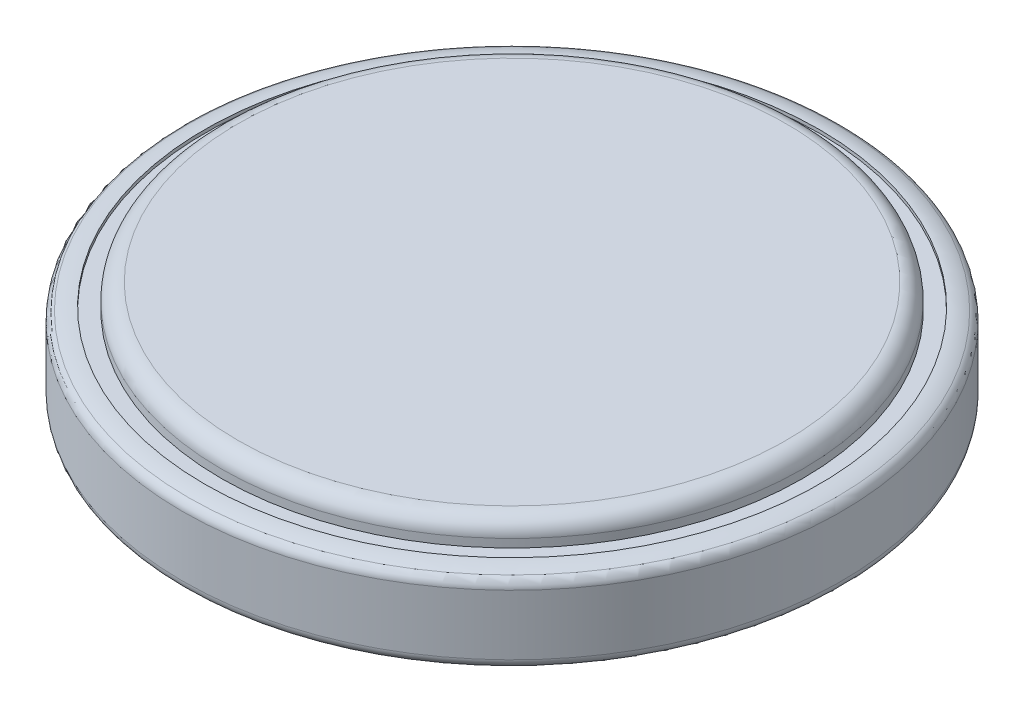
ISO-10303-21;
HEADER;
FILE_DESCRIPTION(('STEP AP214'),'2;1');
FILE_NAME('part.step','',(''),(''),'','','');
FILE_SCHEMA(('AUTOMOTIVE_DESIGN { 1 0 10303 214 1 1 1 1 }'));
ENDSEC;
DATA;
#1=APPLICATION_CONTEXT('core data for automotive mechanical design processes');
#2=APPLICATION_PROTOCOL_DEFINITION('international standard','automotive_design',2000,#1);
#3=PRODUCT_CONTEXT('',#1,'mechanical');
#4=PRODUCT('Part','Part','',(#3));
#5=PRODUCT_RELATED_PRODUCT_CATEGORY('part','',(#4));
#6=PRODUCT_DEFINITION_FORMATION('','',#4);
#7=PRODUCT_DEFINITION_CONTEXT('part definition',#1,'design');
#8=PRODUCT_DEFINITION('design','',#6,#7);
#9=PRODUCT_DEFINITION_SHAPE('','',#8);
#10=(LENGTH_UNIT() NAMED_UNIT(*) SI_UNIT(.MILLI.,.METRE.));
#11=(NAMED_UNIT(*) PLANE_ANGLE_UNIT() SI_UNIT($,.RADIAN.));
#12=(NAMED_UNIT(*) SI_UNIT($,.STERADIAN.) SOLID_ANGLE_UNIT());
#13=UNCERTAINTY_MEASURE_WITH_UNIT(LENGTH_MEASURE(1.E-05),#10,'distance_accuracy_value','');
#14=(GEOMETRIC_REPRESENTATION_CONTEXT(3) GLOBAL_UNCERTAINTY_ASSIGNED_CONTEXT((#13)) GLOBAL_UNIT_ASSIGNED_CONTEXT((#10,
#11,#12)) REPRESENTATION_CONTEXT('',''));
#15=CARTESIAN_POINT('',(0.,0.,0.));
#16=DIRECTION('',(0.,0.,1.));
#17=DIRECTION('',(1.,0.,0.));
#18=AXIS2_PLACEMENT_3D('',#15,#16,#17);
#19=CARTESIAN_POINT('',(0.,3.15,0.));
#20=DIRECTION('',(0.,-1.,0.));
#21=DIRECTION('',(0.,0.,-1.));
#22=AXIS2_PLACEMENT_3D('',#19,#20,#21);
#23=CYLINDRICAL_SURFACE('',#22,9.975);
#24=CARTESIAN_POINT('',(0.,0.3,0.));
#25=DIRECTION('',(0.,1.,0.));
#26=DIRECTION('',(0.,0.,1.));
#27=AXIS2_PLACEMENT_3D('',#24,#25,#26);
#28=CIRCLE('',#27,9.975);
#29=CARTESIAN_POINT('',(0.,0.3,9.975));
#30=VERTEX_POINT('',#29);
#31=EDGE_CURVE('E45',#30,#30,#28,.T.);
#32=ORIENTED_EDGE('',*,*,#31,.T.);
#33=EDGE_LOOP('',(#32));
#34=FACE_BOUND('',#33,.T.);
#35=CARTESIAN_POINT('',(0.,2.121875,0.));
#36=DIRECTION('',(0.,1.,0.));
#37=DIRECTION('',(0.,0.,1.));
#38=AXIS2_PLACEMENT_3D('',#35,#36,#37);
#39=CIRCLE('',#38,9.975);
#40=CARTESIAN_POINT('',(0.,2.121875,9.975));
#41=VERTEX_POINT('',#40);
#42=EDGE_CURVE('E49',#41,#41,#39,.F.);
#43=ORIENTED_EDGE('',*,*,#42,.T.);
#44=EDGE_LOOP('',(#43));
#45=FACE_BOUND('',#44,.T.);
#46=ADVANCED_FACE('F34',(#34,#45),#23,.T.);
#47=CARTESIAN_POINT('',(0.,0.,0.));
#48=DIRECTION('',(0.,1.,0.));
#49=DIRECTION('',(0.,0.,1.));
#50=AXIS2_PLACEMENT_3D('',#47,#48,#49);
#51=PLANE('',#50);
#52=CARTESIAN_POINT('',(0.,0.,0.));
#53=DIRECTION('',(0.,1.,0.));
#54=DIRECTION('',(0.,0.,1.));
#55=AXIS2_PLACEMENT_3D('',#52,#53,#54);
#56=CIRCLE('',#55,9.675);
#57=CARTESIAN_POINT('',(0.,0.,9.675));
#58=VERTEX_POINT('',#57);
#59=EDGE_CURVE('E41',#58,#58,#56,.F.);
#60=ORIENTED_EDGE('',*,*,#59,.T.);
#61=EDGE_LOOP('',(#60));
#62=FACE_BOUND('',#61,.T.);
#63=ADVANCED_FACE('F87',(#62),#51,.F.);
#64=CARTESIAN_POINT('',(0.,1.26093750000001,0.));
#65=DIRECTION('',(0.,-1.,0.));
#66=DIRECTION('',(0.,0.,-1.));
#67=AXIS2_PLACEMENT_3D('',#64,#65,#66);
#68=TOROIDAL_SURFACE('',#67,9.3,1.23906249999999);
#69=CARTESIAN_POINT('',(0.,2.39691659733769,0.));
#70=DIRECTION('',(0.,-1.,0.));
#71=DIRECTION('',(0.,0.,-1.));
#72=AXIS2_PLACEMENT_3D('',#69,#70,#71);
#73=CIRCLE('',#72,9.79480033277867);
#74=CARTESIAN_POINT('',(0.,2.39691659733769,-9.79480033277867));
#75=VERTEX_POINT('',#74);
#76=EDGE_CURVE('E10',#75,#75,#73,.F.);
#77=ORIENTED_EDGE('',*,*,#76,.T.);
#78=EDGE_LOOP('',(#77));
#79=FACE_BOUND('',#78,.T.);
#80=CARTESIAN_POINT('',(0.,2.5,0.));
#81=DIRECTION('',(0.,1.,0.));
#82=DIRECTION('',(0.,0.,1.));
#83=AXIS2_PLACEMENT_3D('',#80,#81,#82);
#84=CIRCLE('',#83,9.3);
#85=CARTESIAN_POINT('',(0.,2.5,9.3));
#86=VERTEX_POINT('',#85);
#87=EDGE_CURVE('E61',#86,#86,#84,.T.);
#88=ORIENTED_EDGE('',*,*,#87,.F.);
#89=EDGE_LOOP('',(#88));
#90=FACE_BOUND('',#89,.T.);
#91=ADVANCED_FACE('F82',(#79,#90),#68,.T.);
#92=CARTESIAN_POINT('',(0.,2.4,0.));
#93=DIRECTION('',(0.,1.,0.));
#94=DIRECTION('',(0.,0.,1.));
#95=AXIS2_PLACEMENT_3D('',#92,#93,#94);
#96=CYLINDRICAL_SURFACE('',#95,9.3);
#97=CARTESIAN_POINT('',(0.,2.4,0.));
#98=DIRECTION('',(0.,1.,0.));
#99=DIRECTION('',(0.,0.,1.));
#100=AXIS2_PLACEMENT_3D('',#97,#98,#99);
#101=CIRCLE('',#100,9.3);
#102=CARTESIAN_POINT('',(0.,2.4,9.3));
#103=VERTEX_POINT('',#102);
#104=EDGE_CURVE('E60',#103,#103,#101,.T.);
#105=ORIENTED_EDGE('',*,*,#104,.F.);
#106=EDGE_LOOP('',(#105));
#107=FACE_BOUND('',#106,.T.);
#108=ORIENTED_EDGE('',*,*,#87,.T.);
#109=EDGE_LOOP('',(#108));
#110=FACE_BOUND('',#109,.T.);
#111=ADVANCED_FACE('F76',(#107,#110),#96,.F.);
#112=CARTESIAN_POINT('',(0.,2.4,0.));
#113=DIRECTION('',(0.,1.,0.));
#114=DIRECTION('',(0.,0.,1.));
#115=AXIS2_PLACEMENT_3D('',#112,#113,#114);
#116=PLANE('',#115);
#117=CARTESIAN_POINT('',(0.,2.4,0.));
#118=DIRECTION('',(0.,1.,0.));
#119=DIRECTION('',(0.,0.,1.));
#120=AXIS2_PLACEMENT_3D('',#117,#118,#119);
#121=CIRCLE('',#120,8.8);
#122=CARTESIAN_POINT('',(0.,2.4,8.8));
#123=VERTEX_POINT('',#122);
#124=EDGE_CURVE('E64',#123,#123,#121,.T.);
#125=ORIENTED_EDGE('',*,*,#124,.F.);
#126=EDGE_LOOP('',(#125));
#127=FACE_BOUND('',#126,.T.);
#128=ORIENTED_EDGE('',*,*,#104,.T.);
#129=EDGE_LOOP('',(#128));
#130=FACE_BOUND('',#129,.T.);
#131=ADVANCED_FACE('F72',(#127,#130),#116,.T.);
#132=CARTESIAN_POINT('',(0.,3.15,0.));
#133=DIRECTION('',(0.,1.,0.));
#134=DIRECTION('',(0.,0.,1.));
#135=AXIS2_PLACEMENT_3D('',#132,#133,#134);
#136=PLANE('',#135);
#137=CARTESIAN_POINT('',(0.,3.15,0.));
#138=DIRECTION('',(0.,1.,0.));
#139=DIRECTION('',(0.,0.,1.));
#140=AXIS2_PLACEMENT_3D('',#137,#138,#139);
#141=CIRCLE('',#140,8.3);
#142=CARTESIAN_POINT('',(0.,3.15,8.3));
#143=VERTEX_POINT('',#142);
#144=EDGE_CURVE('E54',#143,#143,#141,.T.);
#145=ORIENTED_EDGE('',*,*,#144,.T.);
#146=EDGE_LOOP('',(#145));
#147=FACE_BOUND('',#146,.T.);
#148=ADVANCED_FACE('F75',(#147),#136,.T.);
#149=CARTESIAN_POINT('',(0.,2.65,0.));
#150=DIRECTION('',(0.,1.,0.));
#151=DIRECTION('',(0.,0.,1.));
#152=AXIS2_PLACEMENT_3D('',#149,#150,#151);
#153=TOROIDAL_SURFACE('',#152,8.3,0.5);
#154=ORIENTED_EDGE('',*,*,#144,.F.);
#155=EDGE_LOOP('',(#154));
#156=FACE_BOUND('',#155,.T.);
#157=CARTESIAN_POINT('',(0.,2.65,0.));
#158=DIRECTION('',(0.,1.,0.));
#159=DIRECTION('',(0.,0.,1.));
#160=AXIS2_PLACEMENT_3D('',#157,#158,#159);
#161=CIRCLE('',#160,8.8);
#162=CARTESIAN_POINT('',(0.,2.65,8.8));
#163=VERTEX_POINT('',#162);
#164=EDGE_CURVE('E57',#163,#163,#161,.F.);
#165=ORIENTED_EDGE('',*,*,#164,.F.);
#166=EDGE_LOOP('',(#165));
#167=FACE_BOUND('',#166,.T.);
#168=ADVANCED_FACE('F102',(#156,#167),#153,.T.);
#169=CARTESIAN_POINT('',(0.,0.,0.));
#170=DIRECTION('',(0.,-1.,0.));
#171=DIRECTION('',(0.,0.,-1.));
#172=AXIS2_PLACEMENT_3D('',#169,#170,#171);
#173=CYLINDRICAL_SURFACE('',#172,8.8);
#174=ORIENTED_EDGE('',*,*,#164,.T.);
#175=EDGE_LOOP('',(#174));
#176=FACE_BOUND('',#175,.T.);
#177=ORIENTED_EDGE('',*,*,#124,.T.);
#178=EDGE_LOOP('',(#177));
#179=FACE_BOUND('',#178,.T.);
#180=ADVANCED_FACE('F70',(#176,#179),#173,.T.);
#181=CARTESIAN_POINT('',(0.,0.3,0.));
#182=DIRECTION('',(0.,1.,0.));
#183=DIRECTION('',(0.,0.,1.));
#184=AXIS2_PLACEMENT_3D('',#181,#182,#183);
#185=TOROIDAL_SURFACE('',#184,9.675,0.3);
#186=ORIENTED_EDGE('',*,*,#59,.F.);
#187=EDGE_LOOP('',(#186));
#188=FACE_BOUND('',#187,.T.);
#189=ORIENTED_EDGE('',*,*,#31,.F.);
#190=EDGE_LOOP('',(#189));
#191=FACE_BOUND('',#190,.T.);
#192=ADVANCED_FACE('F105',(#188,#191),#185,.T.);
#193=CARTESIAN_POINT('',(0.,2.121875,0.));
#194=DIRECTION('',(0.,1.,0.));
#195=DIRECTION('',(0.,0.,1.));
#196=AXIS2_PLACEMENT_3D('',#193,#194,#195);
#197=TOROIDAL_SURFACE('',#196,9.675,0.3);
#198=ORIENTED_EDGE('',*,*,#76,.F.);
#199=EDGE_LOOP('',(#198));
#200=FACE_BOUND('',#199,.T.);
#201=ORIENTED_EDGE('',*,*,#42,.F.);
#202=EDGE_LOOP('',(#201));
#203=FACE_BOUND('',#202,.T.);
#204=ADVANCED_FACE('F36',(#200,#203),#197,.T.);
#205=CLOSED_SHELL('',(#46,#63,#91,#111,#131,#148,#168,#180,#192,#204));
#206=MANIFOLD_SOLID_BREP('B2',#205);
#207=ADVANCED_BREP_SHAPE_REPRESENTATION('',(#18,#206),#14);
#208=SHAPE_DEFINITION_REPRESENTATION(#9,#207);
ENDSEC;
END-ISO-10303-21;
